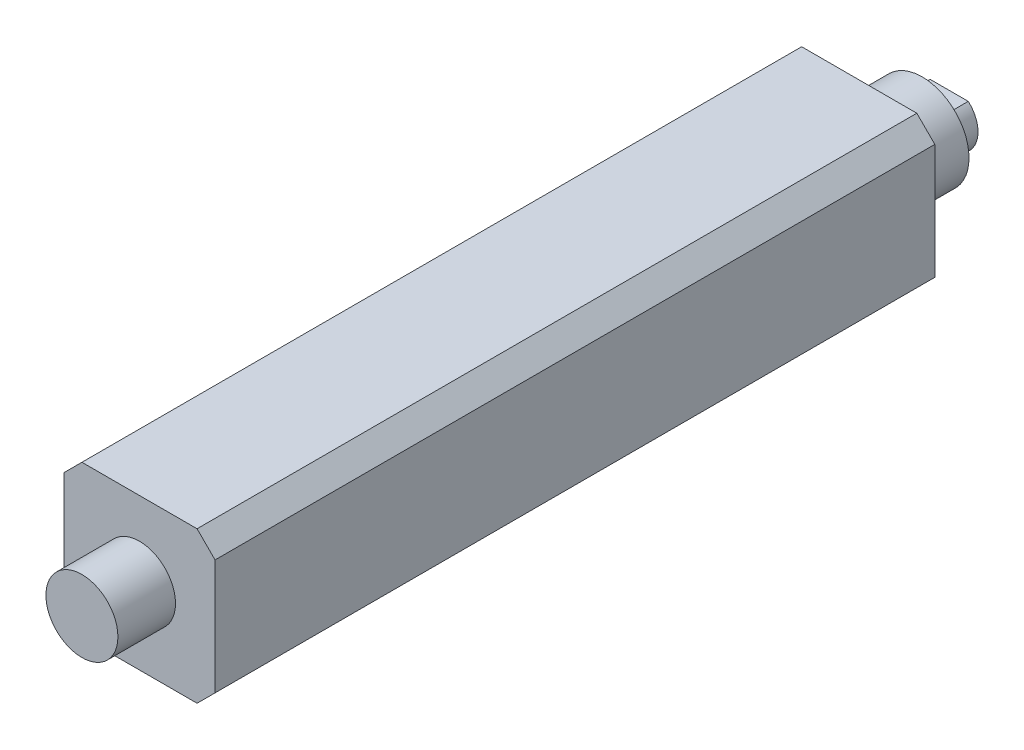
ISO-10303-21;
HEADER;
FILE_DESCRIPTION(('STEP AP214'),'2;1');
FILE_NAME('part.step','',(''),(''),'','','');
FILE_SCHEMA(('AUTOMOTIVE_DESIGN { 1 0 10303 214 1 1 1 1 }'));
ENDSEC;
DATA;
#1=APPLICATION_CONTEXT('core data for automotive mechanical design processes');
#2=APPLICATION_PROTOCOL_DEFINITION('international standard','automotive_design',2000,#1);
#3=PRODUCT_CONTEXT('',#1,'mechanical');
#4=PRODUCT('Part','Part','',(#3));
#5=PRODUCT_RELATED_PRODUCT_CATEGORY('part','',(#4));
#6=PRODUCT_DEFINITION_FORMATION('','',#4);
#7=PRODUCT_DEFINITION_CONTEXT('part definition',#1,'design');
#8=PRODUCT_DEFINITION('design','',#6,#7);
#9=PRODUCT_DEFINITION_SHAPE('','',#8);
#10=(LENGTH_UNIT() NAMED_UNIT(*) SI_UNIT(.MILLI.,.METRE.));
#11=(NAMED_UNIT(*) PLANE_ANGLE_UNIT() SI_UNIT($,.RADIAN.));
#12=(NAMED_UNIT(*) SI_UNIT($,.STERADIAN.) SOLID_ANGLE_UNIT());
#13=UNCERTAINTY_MEASURE_WITH_UNIT(LENGTH_MEASURE(1.E-05),#10,'distance_accuracy_value','');
#14=(GEOMETRIC_REPRESENTATION_CONTEXT(3) GLOBAL_UNCERTAINTY_ASSIGNED_CONTEXT((#13)) GLOBAL_UNIT_ASSIGNED_CONTEXT((#10,
#11,#12)) REPRESENTATION_CONTEXT('',''));
#15=CARTESIAN_POINT('',(0.,0.,0.));
#16=DIRECTION('',(0.,0.,1.));
#17=DIRECTION('',(1.,0.,0.));
#18=AXIS2_PLACEMENT_3D('',#15,#16,#17);
#19=CARTESIAN_POINT('',(-21.,-16.,200.));
#20=DIRECTION('',(1.,0.,0.));
#21=DIRECTION('',(0.,0.,-1.));
#22=AXIS2_PLACEMENT_3D('',#19,#20,#21);
#23=PLANE('',#22);
#24=DIRECTION('',(0.,-1.,0.));
#25=VECTOR('',#24,1.);
#26=CARTESIAN_POINT('',(-21.,-16.,0.));
#27=LINE('',#26,#25);
#28=CARTESIAN_POINT('',(-21.,16.,0.));
#29=VERTEX_POINT('',#28);
#30=CARTESIAN_POINT('',(-21.,-16.,0.));
#31=VERTEX_POINT('',#30);
#32=EDGE_CURVE('E182',#29,#31,#27,.T.);
#33=ORIENTED_EDGE('',*,*,#32,.T.);
#34=DIRECTION('',(0.,0.,-1.));
#35=VECTOR('',#34,1.);
#36=CARTESIAN_POINT('',(-21.,-16.,200.));
#37=LINE('',#36,#35);
#38=CARTESIAN_POINT('',(-21.,-16.,200.));
#39=VERTEX_POINT('',#38);
#40=EDGE_CURVE('E36',#39,#31,#37,.T.);
#41=ORIENTED_EDGE('',*,*,#40,.F.);
#42=DIRECTION('',(0.,-1.,0.));
#43=VECTOR('',#42,1.);
#44=CARTESIAN_POINT('',(-21.,-16.,200.));
#45=LINE('',#44,#43);
#46=CARTESIAN_POINT('',(-21.,16.,200.));
#47=VERTEX_POINT('',#46);
#48=EDGE_CURVE('E185',#47,#39,#45,.T.);
#49=ORIENTED_EDGE('',*,*,#48,.F.);
#50=DIRECTION('',(0.,0.,-1.));
#51=VECTOR('',#50,1.);
#52=CARTESIAN_POINT('',(-21.,16.,200.));
#53=LINE('',#52,#51);
#54=EDGE_CURVE('E203',#47,#29,#53,.T.);
#55=ORIENTED_EDGE('',*,*,#54,.T.);
#56=EDGE_LOOP('',(#33,#41,#49,#55));
#57=FACE_BOUND('',#56,.T.);
#58=ADVANCED_FACE('F33',(#57),#23,.F.);
#59=CARTESIAN_POINT('',(-21.,-16.,200.));
#60=DIRECTION('',(0.707106781186548,0.707106781186547,0.));
#61=DIRECTION('',(-0.707106781186547,0.707106781186548,0.));
#62=AXIS2_PLACEMENT_3D('',#59,#60,#61);
#63=PLANE('',#62);
#64=DIRECTION('',(0.707106781186547,-0.707106781186548,0.));
#65=VECTOR('',#64,1.);
#66=CARTESIAN_POINT('',(-21.,-16.,0.));
#67=LINE('',#66,#65);
#68=CARTESIAN_POINT('',(-16.,-21.,0.));
#69=VERTEX_POINT('',#68);
#70=EDGE_CURVE('E206',#31,#69,#67,.T.);
#71=ORIENTED_EDGE('',*,*,#70,.T.);
#72=DIRECTION('',(0.,0.,-1.));
#73=VECTOR('',#72,1.);
#74=CARTESIAN_POINT('',(-16.,-21.,200.));
#75=LINE('',#74,#73);
#76=CARTESIAN_POINT('',(-16.,-21.,200.));
#77=VERTEX_POINT('',#76);
#78=EDGE_CURVE('E235',#77,#69,#75,.T.);
#79=ORIENTED_EDGE('',*,*,#78,.F.);
#80=DIRECTION('',(0.707106781186547,-0.707106781186548,0.));
#81=VECTOR('',#80,1.);
#82=CARTESIAN_POINT('',(-21.,-16.,200.));
#83=LINE('',#82,#81);
#84=EDGE_CURVE('E188',#39,#77,#83,.T.);
#85=ORIENTED_EDGE('',*,*,#84,.F.);
#86=ORIENTED_EDGE('',*,*,#40,.T.);
#87=EDGE_LOOP('',(#71,#79,#85,#86));
#88=FACE_BOUND('',#87,.T.);
#89=ADVANCED_FACE('F244',(#88),#63,.F.);
#90=CARTESIAN_POINT('',(-16.,-21.,200.));
#91=DIRECTION('',(0.,1.,0.));
#92=DIRECTION('',(0.,0.,1.));
#93=AXIS2_PLACEMENT_3D('',#90,#91,#92);
#94=PLANE('',#93);
#95=DIRECTION('',(1.,0.,0.));
#96=VECTOR('',#95,1.);
#97=CARTESIAN_POINT('',(-16.,-21.,0.));
#98=LINE('',#97,#96);
#99=CARTESIAN_POINT('',(16.,-21.,0.));
#100=VERTEX_POINT('',#99);
#101=EDGE_CURVE('E208',#69,#100,#98,.T.);
#102=ORIENTED_EDGE('',*,*,#101,.T.);
#103=DIRECTION('',(0.,0.,-1.));
#104=VECTOR('',#103,1.);
#105=CARTESIAN_POINT('',(16.,-21.,200.));
#106=LINE('',#105,#104);
#107=CARTESIAN_POINT('',(16.,-21.,200.));
#108=VERTEX_POINT('',#107);
#109=EDGE_CURVE('E233',#108,#100,#106,.T.);
#110=ORIENTED_EDGE('',*,*,#109,.F.);
#111=DIRECTION('',(1.,0.,0.));
#112=VECTOR('',#111,1.);
#113=CARTESIAN_POINT('',(-16.,-21.,200.));
#114=LINE('',#113,#112);
#115=EDGE_CURVE('E191',#77,#108,#114,.T.);
#116=ORIENTED_EDGE('',*,*,#115,.F.);
#117=ORIENTED_EDGE('',*,*,#78,.T.);
#118=EDGE_LOOP('',(#102,#110,#116,#117));
#119=FACE_BOUND('',#118,.T.);
#120=ADVANCED_FACE('F256',(#119),#94,.F.);
#121=CARTESIAN_POINT('',(16.,-21.,200.));
#122=DIRECTION('',(-0.707106781186548,0.707106781186548,0.));
#123=DIRECTION('',(-0.707106781186548,-0.707106781186548,0.));
#124=AXIS2_PLACEMENT_3D('',#121,#122,#123);
#125=PLANE('',#124);
#126=DIRECTION('',(0.707106781186548,0.707106781186548,0.));
#127=VECTOR('',#126,1.);
#128=CARTESIAN_POINT('',(16.,-21.,0.));
#129=LINE('',#128,#127);
#130=CARTESIAN_POINT('',(21.,-16.,0.));
#131=VERTEX_POINT('',#130);
#132=EDGE_CURVE('E210',#100,#131,#129,.T.);
#133=ORIENTED_EDGE('',*,*,#132,.T.);
#134=DIRECTION('',(0.,0.,-1.));
#135=VECTOR('',#134,1.);
#136=CARTESIAN_POINT('',(21.,-16.,200.));
#137=LINE('',#136,#135);
#138=CARTESIAN_POINT('',(21.,-16.,200.));
#139=VERTEX_POINT('',#138);
#140=EDGE_CURVE('E230',#139,#131,#137,.T.);
#141=ORIENTED_EDGE('',*,*,#140,.F.);
#142=DIRECTION('',(0.707106781186548,0.707106781186548,0.));
#143=VECTOR('',#142,1.);
#144=CARTESIAN_POINT('',(16.,-21.,200.));
#145=LINE('',#144,#143);
#146=EDGE_CURVE('E193',#108,#139,#145,.T.);
#147=ORIENTED_EDGE('',*,*,#146,.F.);
#148=ORIENTED_EDGE('',*,*,#109,.T.);
#149=EDGE_LOOP('',(#133,#141,#147,#148));
#150=FACE_BOUND('',#149,.T.);
#151=ADVANCED_FACE('F259',(#150),#125,.F.);
#152=CARTESIAN_POINT('',(21.,-16.,200.));
#153=DIRECTION('',(-1.,0.,0.));
#154=DIRECTION('',(0.,0.,1.));
#155=AXIS2_PLACEMENT_3D('',#152,#153,#154);
#156=PLANE('',#155);
#157=DIRECTION('',(0.,1.,0.));
#158=VECTOR('',#157,1.);
#159=CARTESIAN_POINT('',(21.,-16.,0.));
#160=LINE('',#159,#158);
#161=CARTESIAN_POINT('',(21.,16.,0.));
#162=VERTEX_POINT('',#161);
#163=EDGE_CURVE('E212',#131,#162,#160,.T.);
#164=ORIENTED_EDGE('',*,*,#163,.T.);
#165=DIRECTION('',(0.,0.,-1.));
#166=VECTOR('',#165,1.);
#167=CARTESIAN_POINT('',(21.,16.,200.));
#168=LINE('',#167,#166);
#169=CARTESIAN_POINT('',(21.,16.,200.));
#170=VERTEX_POINT('',#169);
#171=EDGE_CURVE('E227',#170,#162,#168,.T.);
#172=ORIENTED_EDGE('',*,*,#171,.F.);
#173=DIRECTION('',(0.,1.,0.));
#174=VECTOR('',#173,1.);
#175=CARTESIAN_POINT('',(21.,-16.,200.));
#176=LINE('',#175,#174);
#177=EDGE_CURVE('E195',#139,#170,#176,.T.);
#178=ORIENTED_EDGE('',*,*,#177,.F.);
#179=ORIENTED_EDGE('',*,*,#140,.T.);
#180=EDGE_LOOP('',(#164,#172,#178,#179));
#181=FACE_BOUND('',#180,.T.);
#182=ADVANCED_FACE('F278',(#181),#156,.F.);
#183=CARTESIAN_POINT('',(16.,21.,200.));
#184=DIRECTION('',(-0.707106781186547,-0.707106781186548,0.));
#185=DIRECTION('',(0.707106781186548,-0.707106781186547,0.));
#186=AXIS2_PLACEMENT_3D('',#183,#184,#185);
#187=PLANE('',#186);
#188=DIRECTION('',(-0.707106781186548,0.707106781186547,0.));
#189=VECTOR('',#188,1.);
#190=CARTESIAN_POINT('',(16.,21.,0.));
#191=LINE('',#190,#189);
#192=CARTESIAN_POINT('',(16.,21.,0.));
#193=VERTEX_POINT('',#192);
#194=EDGE_CURVE('E214',#162,#193,#191,.T.);
#195=ORIENTED_EDGE('',*,*,#194,.T.);
#196=DIRECTION('',(0.,0.,-1.));
#197=VECTOR('',#196,1.);
#198=CARTESIAN_POINT('',(16.,21.,200.));
#199=LINE('',#198,#197);
#200=CARTESIAN_POINT('',(16.,21.,200.));
#201=VERTEX_POINT('',#200);
#202=EDGE_CURVE('E224',#201,#193,#199,.T.);
#203=ORIENTED_EDGE('',*,*,#202,.F.);
#204=DIRECTION('',(-0.707106781186548,0.707106781186547,0.));
#205=VECTOR('',#204,1.);
#206=CARTESIAN_POINT('',(16.,21.,200.));
#207=LINE('',#206,#205);
#208=EDGE_CURVE('E197',#170,#201,#207,.T.);
#209=ORIENTED_EDGE('',*,*,#208,.F.);
#210=ORIENTED_EDGE('',*,*,#171,.T.);
#211=EDGE_LOOP('',(#195,#203,#209,#210));
#212=FACE_BOUND('',#211,.T.);
#213=ADVANCED_FACE('F275',(#212),#187,.F.);
#214=CARTESIAN_POINT('',(-16.,21.,200.));
#215=DIRECTION('',(0.,-1.,0.));
#216=DIRECTION('',(0.,0.,-1.));
#217=AXIS2_PLACEMENT_3D('',#214,#215,#216);
#218=PLANE('',#217);
#219=DIRECTION('',(-1.,0.,0.));
#220=VECTOR('',#219,1.);
#221=CARTESIAN_POINT('',(-16.,21.,0.));
#222=LINE('',#221,#220);
#223=CARTESIAN_POINT('',(-16.,21.,0.));
#224=VERTEX_POINT('',#223);
#225=EDGE_CURVE('E216',#193,#224,#222,.T.);
#226=ORIENTED_EDGE('',*,*,#225,.T.);
#227=DIRECTION('',(0.,0.,-1.));
#228=VECTOR('',#227,1.);
#229=CARTESIAN_POINT('',(-16.,21.,200.));
#230=LINE('',#229,#228);
#231=CARTESIAN_POINT('',(-16.,21.,200.));
#232=VERTEX_POINT('',#231);
#233=EDGE_CURVE('E221',#232,#224,#230,.T.);
#234=ORIENTED_EDGE('',*,*,#233,.F.);
#235=DIRECTION('',(-1.,0.,0.));
#236=VECTOR('',#235,1.);
#237=CARTESIAN_POINT('',(-16.,21.,200.));
#238=LINE('',#237,#236);
#239=EDGE_CURVE('E199',#201,#232,#238,.T.);
#240=ORIENTED_EDGE('',*,*,#239,.F.);
#241=ORIENTED_EDGE('',*,*,#202,.T.);
#242=EDGE_LOOP('',(#226,#234,#240,#241));
#243=FACE_BOUND('',#242,.T.);
#244=ADVANCED_FACE('F271',(#243),#218,.F.);
#245=CARTESIAN_POINT('',(-21.,16.,200.));
#246=DIRECTION('',(0.707106781186547,-0.707106781186547,0.));
#247=DIRECTION('',(0.707106781186548,0.707106781186548,0.));
#248=AXIS2_PLACEMENT_3D('',#245,#246,#247);
#249=PLANE('',#248);
#250=DIRECTION('',(-0.707106781186547,-0.707106781186547,0.));
#251=VECTOR('',#250,1.);
#252=CARTESIAN_POINT('',(-21.,16.,0.));
#253=LINE('',#252,#251);
#254=EDGE_CURVE('E189',#224,#29,#253,.T.);
#255=ORIENTED_EDGE('',*,*,#254,.T.);
#256=ORIENTED_EDGE('',*,*,#54,.F.);
#257=DIRECTION('',(-0.707106781186547,-0.707106781186547,0.));
#258=VECTOR('',#257,1.);
#259=CARTESIAN_POINT('',(-21.,16.,200.));
#260=LINE('',#259,#258);
#261=EDGE_CURVE('E201',#232,#47,#260,.T.);
#262=ORIENTED_EDGE('',*,*,#261,.F.);
#263=ORIENTED_EDGE('',*,*,#233,.T.);
#264=EDGE_LOOP('',(#255,#256,#262,#263));
#265=FACE_BOUND('',#264,.T.);
#266=ADVANCED_FACE('F269',(#265),#249,.F.);
#267=CARTESIAN_POINT('',(0.,0.,200.));
#268=DIRECTION('',(0.,0.,-1.));
#269=DIRECTION('',(-1.,0.,0.));
#270=AXIS2_PLACEMENT_3D('',#267,#268,#269);
#271=PLANE('',#270);
#272=CARTESIAN_POINT('',(0.,0.,200.));
#273=DIRECTION('',(0.,0.,1.));
#274=DIRECTION('',(1.,0.,0.));
#275=AXIS2_PLACEMENT_3D('',#272,#273,#274);
#276=CIRCLE('',#275,10.);
#277=CARTESIAN_POINT('',(10.,0.,200.));
#278=VERTEX_POINT('',#277);
#279=EDGE_CURVE('E11',#278,#278,#276,.T.);
#280=ORIENTED_EDGE('',*,*,#279,.F.);
#281=EDGE_LOOP('',(#280));
#282=FACE_BOUND('',#281,.T.);
#283=ORIENTED_EDGE('',*,*,#48,.T.);
#284=ORIENTED_EDGE('',*,*,#84,.T.);
#285=ORIENTED_EDGE('',*,*,#115,.T.);
#286=ORIENTED_EDGE('',*,*,#146,.T.);
#287=ORIENTED_EDGE('',*,*,#177,.T.);
#288=ORIENTED_EDGE('',*,*,#208,.T.);
#289=ORIENTED_EDGE('',*,*,#239,.T.);
#290=ORIENTED_EDGE('',*,*,#261,.T.);
#291=EDGE_LOOP('',(#283,#284,#285,#286,#287,#288,#289,#290));
#292=FACE_BOUND('',#291,.T.);
#293=ADVANCED_FACE('F263',(#282,#292),#271,.F.);
#294=CARTESIAN_POINT('',(0.,0.,0.));
#295=DIRECTION('',(0.,0.,-1.));
#296=DIRECTION('',(-1.,0.,0.));
#297=AXIS2_PLACEMENT_3D('',#294,#295,#296);
#298=PLANE('',#297);
#299=CARTESIAN_POINT('',(0.,0.,0.));
#300=DIRECTION('',(0.,0.,1.));
#301=DIRECTION('',(1.,0.,0.));
#302=AXIS2_PLACEMENT_3D('',#299,#300,#301);
#303=CIRCLE('',#302,15.);
#304=CARTESIAN_POINT('',(15.,0.,0.));
#305=VERTEX_POINT('',#304);
#306=EDGE_CURVE('E176',#305,#305,#303,.T.);
#307=ORIENTED_EDGE('',*,*,#306,.T.);
#308=EDGE_LOOP('',(#307));
#309=FACE_BOUND('',#308,.T.);
#310=ORIENTED_EDGE('',*,*,#32,.F.);
#311=ORIENTED_EDGE('',*,*,#254,.F.);
#312=ORIENTED_EDGE('',*,*,#225,.F.);
#313=ORIENTED_EDGE('',*,*,#194,.F.);
#314=ORIENTED_EDGE('',*,*,#163,.F.);
#315=ORIENTED_EDGE('',*,*,#132,.F.);
#316=ORIENTED_EDGE('',*,*,#101,.F.);
#317=ORIENTED_EDGE('',*,*,#70,.F.);
#318=EDGE_LOOP('',(#310,#311,#312,#313,#314,#315,#316,#317));
#319=FACE_BOUND('',#318,.T.);
#320=ADVANCED_FACE('F251',(#309,#319),#298,.T.);
#321=CARTESIAN_POINT('',(0.,0.,-3.));
#322=DIRECTION('',(0.,0.,1.));
#323=DIRECTION('',(1.,0.,0.));
#324=AXIS2_PLACEMENT_3D('',#321,#322,#323);
#325=CYLINDRICAL_SURFACE('',#324,15.);
#326=CARTESIAN_POINT('',(0.,0.,-3.));
#327=DIRECTION('',(0.,0.,1.));
#328=DIRECTION('',(1.,0.,0.));
#329=AXIS2_PLACEMENT_3D('',#326,#327,#328);
#330=CIRCLE('',#329,15.);
#331=CARTESIAN_POINT('',(15.,0.,-3.));
#332=VERTEX_POINT('',#331);
#333=EDGE_CURVE('E179',#332,#332,#330,.T.);
#334=ORIENTED_EDGE('',*,*,#333,.T.);
#335=EDGE_LOOP('',(#334));
#336=FACE_BOUND('',#335,.T.);
#337=ORIENTED_EDGE('',*,*,#306,.F.);
#338=EDGE_LOOP('',(#337));
#339=FACE_BOUND('',#338,.T.);
#340=ADVANCED_FACE('F338',(#336,#339),#325,.T.);
#341=CARTESIAN_POINT('',(0.,0.,-3.));
#342=DIRECTION('',(0.,0.,1.));
#343=DIRECTION('',(1.,0.,0.));
#344=AXIS2_PLACEMENT_3D('',#341,#342,#343);
#345=PLANE('',#344);
#346=CARTESIAN_POINT('',(0.,0.,-3.));
#347=DIRECTION('',(0.,0.,-1.));
#348=DIRECTION('',(-1.,0.,0.));
#349=AXIS2_PLACEMENT_3D('',#346,#347,#348);
#350=CIRCLE('',#349,13.);
#351=CARTESIAN_POINT('',(13.,0.,-3.));
#352=VERTEX_POINT('',#351);
#353=EDGE_CURVE('E172',#352,#352,#350,.T.);
#354=ORIENTED_EDGE('',*,*,#353,.F.);
#355=EDGE_LOOP('',(#354));
#356=FACE_BOUND('',#355,.T.);
#357=ORIENTED_EDGE('',*,*,#333,.F.);
#358=EDGE_LOOP('',(#357));
#359=FACE_BOUND('',#358,.T.);
#360=ADVANCED_FACE('F348',(#356,#359),#345,.F.);
#361=CARTESIAN_POINT('',(0.,0.,-17.5));
#362=DIRECTION('',(0.,0.,1.));
#363=DIRECTION('',(1.,0.,0.));
#364=AXIS2_PLACEMENT_3D('',#361,#362,#363);
#365=CYLINDRICAL_SURFACE('',#364,13.);
#366=CARTESIAN_POINT('',(0.,0.,-17.5));
#367=DIRECTION('',(0.,0.,-1.));
#368=DIRECTION('',(-1.,0.,0.));
#369=AXIS2_PLACEMENT_3D('',#366,#367,#368);
#370=CIRCLE('',#369,13.);
#371=CARTESIAN_POINT('',(13.,0.,-17.5));
#372=VERTEX_POINT('',#371);
#373=EDGE_CURVE('E173',#372,#372,#370,.T.);
#374=CARTESIAN_POINT('',(13.,0.,-17.5));
#375=CARTESIAN_POINT('',(13.,0.,-17.3489583333333));
#376=CARTESIAN_POINT('',(13.,0.,-17.1979166666667));
#377=CARTESIAN_POINT('',(13.,0.,-16.8958333333333));
#378=CARTESIAN_POINT('',(13.,0.,-16.7447916666667));
#379=CARTESIAN_POINT('',(13.,0.,-16.4427083333333));
#380=CARTESIAN_POINT('',(13.,0.,-16.2916666666667));
#381=CARTESIAN_POINT('',(13.,0.,-15.9895833333333));
#382=CARTESIAN_POINT('',(13.,0.,-15.8385416666667));
#383=CARTESIAN_POINT('',(13.,0.,-15.5364583333333));
#384=CARTESIAN_POINT('',(13.,0.,-15.3854166666667));
#385=CARTESIAN_POINT('',(13.,0.,-15.0833333333333));
#386=CARTESIAN_POINT('',(13.,0.,-14.9322916666667));
#387=CARTESIAN_POINT('',(13.,0.,-14.6302083333333));
#388=CARTESIAN_POINT('',(13.,0.,-14.4791666666667));
#389=CARTESIAN_POINT('',(13.,0.,-14.1770833333333));
#390=CARTESIAN_POINT('',(13.,0.,-14.0260416666667));
#391=CARTESIAN_POINT('',(13.,0.,-13.7239583333333));
#392=CARTESIAN_POINT('',(13.,0.,-13.5729166666667));
#393=CARTESIAN_POINT('',(13.,0.,-13.2708333333333));
#394=CARTESIAN_POINT('',(13.,0.,-13.1197916666667));
#395=CARTESIAN_POINT('',(13.,0.,-12.8177083333333));
#396=CARTESIAN_POINT('',(13.,0.,-12.6666666666667));
#397=CARTESIAN_POINT('',(13.,0.,-12.3645833333333));
#398=CARTESIAN_POINT('',(13.,0.,-12.2135416666667));
#399=CARTESIAN_POINT('',(13.,0.,-11.9114583333333));
#400=CARTESIAN_POINT('',(13.,0.,-11.7604166666667));
#401=CARTESIAN_POINT('',(13.,0.,-11.4583333333333));
#402=CARTESIAN_POINT('',(13.,0.,-11.3072916666667));
#403=CARTESIAN_POINT('',(13.,0.,-11.0052083333333));
#404=CARTESIAN_POINT('',(13.,0.,-10.8541666666667));
#405=CARTESIAN_POINT('',(13.,0.,-10.5520833333333));
#406=CARTESIAN_POINT('',(13.,0.,-10.4010416666667));
#407=CARTESIAN_POINT('',(13.,0.,-10.0989583333333));
#408=CARTESIAN_POINT('',(13.,0.,-9.94791666666667));
#409=CARTESIAN_POINT('',(13.,0.,-9.64583333333333));
#410=CARTESIAN_POINT('',(13.,0.,-9.49479166666667));
#411=CARTESIAN_POINT('',(13.,0.,-9.19270833333333));
#412=CARTESIAN_POINT('',(13.,0.,-9.04166666666667));
#413=CARTESIAN_POINT('',(13.,0.,-8.73958333333333));
#414=CARTESIAN_POINT('',(13.,0.,-8.58854166666667));
#415=CARTESIAN_POINT('',(13.,0.,-8.28645833333334));
#416=CARTESIAN_POINT('',(13.,0.,-8.13541666666667));
#417=CARTESIAN_POINT('',(13.,0.,-7.83333333333333));
#418=CARTESIAN_POINT('',(13.,0.,-7.68229166666667));
#419=CARTESIAN_POINT('',(13.,0.,-7.38020833333333));
#420=CARTESIAN_POINT('',(13.,0.,-7.22916666666667));
#421=CARTESIAN_POINT('',(13.,0.,-6.92708333333333));
#422=CARTESIAN_POINT('',(13.,0.,-6.77604166666667));
#423=CARTESIAN_POINT('',(13.,0.,-6.47395833333333));
#424=CARTESIAN_POINT('',(13.,0.,-6.32291666666667));
#425=CARTESIAN_POINT('',(13.,0.,-6.02083333333333));
#426=CARTESIAN_POINT('',(13.,0.,-5.86979166666667));
#427=CARTESIAN_POINT('',(13.,0.,-5.56770833333333));
#428=CARTESIAN_POINT('',(13.,0.,-5.41666666666667));
#429=CARTESIAN_POINT('',(13.,0.,-5.11458333333333));
#430=CARTESIAN_POINT('',(13.,0.,-4.96354166666667));
#431=CARTESIAN_POINT('',(13.,0.,-4.66145833333333));
#432=CARTESIAN_POINT('',(13.,0.,-4.51041666666667));
#433=CARTESIAN_POINT('',(13.,0.,-4.20833333333333));
#434=CARTESIAN_POINT('',(13.,0.,-4.05729166666667));
#435=CARTESIAN_POINT('',(13.,0.,-3.75520833333333));
#436=CARTESIAN_POINT('',(13.,0.,-3.60416666666667));
#437=CARTESIAN_POINT('',(13.,0.,-3.30208333333333));
#438=CARTESIAN_POINT('',(13.,0.,-3.15104166666667));
#439=CARTESIAN_POINT('',(13.,0.,-3.));
#440=B_SPLINE_CURVE_WITH_KNOTS('',3,(#374,#375,#376,#377,#378,#379,#380,#381,#382,#383,#384,
#385,#386,#387,#388,#389,#390,#391,#392,#393,#394,#395,#396,#397,#398,#399,#400,#401,#402,#403,
#404,#405,#406,#407,#408,#409,#410,#411,#412,#413,#414,#415,#416,#417,#418,#419,#420,#421,#422,
#423,#424,#425,#426,#427,#428,#429,#430,#431,#432,#433,#434,#435,#436,#437,#438,#439),
.UNSPECIFIED.,.F.,.F.,(4,2,2,2,2,2,2,2,2,2,2,2,2,2,2,2,2,2,2,2,2,2,2,2,2,2,2,2,2,2,2,2,4),(0.,
0.453125000000002,0.906250000000001,1.359375,1.8125,2.265625,2.71875,3.171875,3.625,4.078125,
4.53125,4.984375,5.4375,5.890625,6.34375,6.796875,7.25,7.703125,8.15625,8.609375,9.0625,
9.515625,9.96875,10.421875,10.875,11.328125,11.78125,12.234375,12.6875,13.140625,13.59375,
14.046875,14.5),.UNSPECIFIED.);
#441=EDGE_CURVE('BSEAM358',#372,#352,#440,.T.);
#442=ORIENTED_EDGE('',*,*,#373,.F.);
#443=ORIENTED_EDGE('',*,*,#353,.T.);
#444=ORIENTED_EDGE('',*,*,#441,.T.);
#445=ORIENTED_EDGE('',*,*,#441,.F.);
#446=EDGE_LOOP('',(#442,#444,#443,#445));
#447=FACE_BOUND('',#446,.T.);
#448=ADVANCED_FACE('F358',(#447),#365,.T.);
#449=CARTESIAN_POINT('',(0.,0.,-17.5));
#450=DIRECTION('',(0.,0.,-1.));
#451=DIRECTION('',(-1.,0.,0.));
#452=AXIS2_PLACEMENT_3D('',#449,#450,#451);
#453=PLANE('',#452);
#454=CARTESIAN_POINT('',(0.,0.,-17.5));
#455=DIRECTION('',(0.,0.,-1.));
#456=DIRECTION('',(-1.,0.,0.));
#457=AXIS2_PLACEMENT_3D('',#454,#455,#456);
#458=CIRCLE('',#457,8.);
#459=CARTESIAN_POINT('',(-8.,0.,-17.5));
#460=VERTEX_POINT('',#459);
#461=EDGE_CURVE('E41',#460,#460,#458,.T.);
#462=ORIENTED_EDGE('',*,*,#461,.F.);
#463=EDGE_LOOP('',(#462));
#464=FACE_BOUND('',#463,.T.);
#465=ORIENTED_EDGE('',*,*,#373,.T.);
#466=EDGE_LOOP('',(#465));
#467=FACE_BOUND('',#466,.T.);
#468=ADVANCED_FACE('F368',(#464,#467),#453,.T.);
#469=CARTESIAN_POINT('',(0.,0.,-25.));
#470=DIRECTION('',(0.,0.,1.));
#471=DIRECTION('',(1.,0.,0.));
#472=AXIS2_PLACEMENT_3D('',#469,#470,#471);
#473=CYLINDRICAL_SURFACE('',#472,8.);
#474=CARTESIAN_POINT('',(0.,0.,-25.));
#475=DIRECTION('',(0.,0.,-1.));
#476=DIRECTION('',(-1.,0.,0.));
#477=AXIS2_PLACEMENT_3D('',#474,#475,#476);
#478=CIRCLE('',#477,8.);
#479=CARTESIAN_POINT('',(5.29150262212918,6.,-25.));
#480=VERTEX_POINT('',#479);
#481=CARTESIAN_POINT('',(5.29150262212918,-6.,-25.));
#482=VERTEX_POINT('',#481);
#483=EDGE_CURVE('E169',#480,#482,#478,.T.);
#484=ORIENTED_EDGE('',*,*,#483,.F.);
#485=DIRECTION('',(0.,0.,-1.));
#486=VECTOR('',#485,1.);
#487=CARTESIAN_POINT('',(5.29150262212918,6.,-20.));
#488=LINE('',#487,#486);
#489=CARTESIAN_POINT('',(5.29150262212918,6.,-20.));
#490=VERTEX_POINT('',#489);
#491=EDGE_CURVE('E57',#490,#480,#488,.T.);
#492=ORIENTED_EDGE('',*,*,#491,.F.);
#493=CARTESIAN_POINT('',(0.,0.,-20.));
#494=DIRECTION('',(0.,0.,-1.));
#495=DIRECTION('',(-1.,0.,0.));
#496=AXIS2_PLACEMENT_3D('',#493,#494,#495);
#497=CIRCLE('',#496,8.);
#498=CARTESIAN_POINT('',(-5.29150262212918,6.,-20.));
#499=VERTEX_POINT('',#498);
#500=EDGE_CURVE('E144',#499,#490,#497,.T.);
#501=ORIENTED_EDGE('',*,*,#500,.F.);
#502=DIRECTION('',(0.,0.,-1.));
#503=VECTOR('',#502,1.);
#504=CARTESIAN_POINT('',(-5.29150262212918,6.,-20.));
#505=LINE('',#504,#503);
#506=CARTESIAN_POINT('',(-5.29150262212918,6.,-25.));
#507=VERTEX_POINT('',#506);
#508=EDGE_CURVE('E152',#499,#507,#505,.T.);
#509=ORIENTED_EDGE('',*,*,#508,.T.);
#510=CARTESIAN_POINT('',(-5.29150262212918,-6.,-25.));
#511=VERTEX_POINT('',#510);
#512=EDGE_CURVE('E165',#511,#507,#478,.T.);
#513=ORIENTED_EDGE('',*,*,#512,.F.);
#514=DIRECTION('',(0.,0.,-1.));
#515=VECTOR('',#514,1.);
#516=CARTESIAN_POINT('',(-5.29150262212918,-6.,-20.));
#517=LINE('',#516,#515);
#518=CARTESIAN_POINT('',(-5.29150262212918,-6.,-20.));
#519=VERTEX_POINT('',#518);
#520=EDGE_CURVE('E49',#519,#511,#517,.T.);
#521=ORIENTED_EDGE('',*,*,#520,.F.);
#522=CARTESIAN_POINT('',(0.,0.,-20.));
#523=DIRECTION('',(0.,0.,-1.));
#524=DIRECTION('',(-1.,0.,0.));
#525=AXIS2_PLACEMENT_3D('',#522,#523,#524);
#526=CIRCLE('',#525,8.);
#527=CARTESIAN_POINT('',(5.29150262212918,-6.,-20.));
#528=VERTEX_POINT('',#527);
#529=EDGE_CURVE('E139',#528,#519,#526,.T.);
#530=ORIENTED_EDGE('',*,*,#529,.F.);
#531=DIRECTION('',(0.,0.,-1.));
#532=VECTOR('',#531,1.);
#533=CARTESIAN_POINT('',(5.29150262212918,-6.,-20.));
#534=LINE('',#533,#532);
#535=EDGE_CURVE('E151',#528,#482,#534,.T.);
#536=ORIENTED_EDGE('',*,*,#535,.T.);
#537=EDGE_LOOP('',(#484,#492,#501,#509,#513,#521,#530,#536));
#538=FACE_BOUND('',#537,.T.);
#539=ORIENTED_EDGE('',*,*,#461,.T.);
#540=EDGE_LOOP('',(#539));
#541=FACE_BOUND('',#540,.T.);
#542=ADVANCED_FACE('F378',(#538,#541),#473,.T.);
#543=CARTESIAN_POINT('',(0.,0.,-25.));
#544=DIRECTION('',(0.,0.,-1.));
#545=DIRECTION('',(-1.,0.,0.));
#546=AXIS2_PLACEMENT_3D('',#543,#544,#545);
#547=PLANE('',#546);
#548=CARTESIAN_POINT('',(0.,0.,-25.));
#549=DIRECTION('',(0.,0.,-1.));
#550=DIRECTION('',(-1.,0.,0.));
#551=AXIS2_PLACEMENT_3D('',#548,#549,#550);
#552=CIRCLE('',#551,4.4);
#553=CARTESIAN_POINT('',(-4.4,0.,-25.));
#554=VERTEX_POINT('',#553);
#555=EDGE_CURVE('E137',#554,#554,#552,.T.);
#556=ORIENTED_EDGE('',*,*,#555,.F.);
#557=EDGE_LOOP('',(#556));
#558=FACE_BOUND('',#557,.T.);
#559=DIRECTION('',(-1.,0.,0.));
#560=VECTOR('',#559,1.);
#561=CARTESIAN_POINT('',(5.29150262212918,6.,-25.));
#562=LINE('',#561,#560);
#563=EDGE_CURVE('E147',#480,#507,#562,.T.);
#564=ORIENTED_EDGE('',*,*,#563,.F.);
#565=ORIENTED_EDGE('',*,*,#483,.T.);
#566=DIRECTION('',(1.,0.,0.));
#567=VECTOR('',#566,1.);
#568=CARTESIAN_POINT('',(5.29150262212918,-6.,-25.));
#569=LINE('',#568,#567);
#570=EDGE_CURVE('E136',#511,#482,#569,.T.);
#571=ORIENTED_EDGE('',*,*,#570,.F.);
#572=ORIENTED_EDGE('',*,*,#512,.T.);
#573=EDGE_LOOP('',(#564,#565,#571,#572));
#574=FACE_BOUND('',#573,.T.);
#575=ADVANCED_FACE('F399',(#558,#574),#547,.T.);
#576=CARTESIAN_POINT('',(0.,0.,216.));
#577=DIRECTION('',(0.,0.,-1.));
#578=DIRECTION('',(-1.,0.,0.));
#579=AXIS2_PLACEMENT_3D('',#576,#577,#578);
#580=CYLINDRICAL_SURFACE('',#579,10.);
#581=CARTESIAN_POINT('',(0.,0.,216.));
#582=DIRECTION('',(0.,0.,1.));
#583=DIRECTION('',(1.,0.,0.));
#584=AXIS2_PLACEMENT_3D('',#581,#582,#583);
#585=CIRCLE('',#584,10.);
#586=CARTESIAN_POINT('',(10.,0.,216.));
#587=VERTEX_POINT('',#586);
#588=EDGE_CURVE('E155',#587,#587,#585,.T.);
#589=ORIENTED_EDGE('',*,*,#588,.F.);
#590=EDGE_LOOP('',(#589));
#591=FACE_BOUND('',#590,.T.);
#592=ORIENTED_EDGE('',*,*,#279,.T.);
#593=EDGE_LOOP('',(#592));
#594=FACE_BOUND('',#593,.T.);
#595=ADVANCED_FACE('F393',(#591,#594),#580,.T.);
#596=CARTESIAN_POINT('',(0.,0.,216.));
#597=DIRECTION('',(0.,0.,1.));
#598=DIRECTION('',(1.,0.,0.));
#599=AXIS2_PLACEMENT_3D('',#596,#597,#598);
#600=PLANE('',#599);
#601=ORIENTED_EDGE('',*,*,#588,.T.);
#602=EDGE_LOOP('',(#601));
#603=FACE_BOUND('',#602,.T.);
#604=ADVANCED_FACE('F398',(#603),#600,.T.);
#605=CARTESIAN_POINT('',(5.29150262212918,-6.,-20.));
#606=DIRECTION('',(0.,1.,0.));
#607=DIRECTION('',(0.,0.,1.));
#608=AXIS2_PLACEMENT_3D('',#605,#606,#607);
#609=PLANE('',#608);
#610=ORIENTED_EDGE('',*,*,#570,.T.);
#611=ORIENTED_EDGE('',*,*,#535,.F.);
#612=DIRECTION('',(1.,0.,0.));
#613=VECTOR('',#612,1.);
#614=CARTESIAN_POINT('',(5.29150262212918,-6.,-20.));
#615=LINE('',#614,#613);
#616=EDGE_CURVE('E158',#519,#528,#615,.T.);
#617=ORIENTED_EDGE('',*,*,#616,.F.);
#618=ORIENTED_EDGE('',*,*,#520,.T.);
#619=EDGE_LOOP('',(#610,#611,#617,#618));
#620=FACE_BOUND('',#619,.T.);
#621=ADVANCED_FACE('F411',(#620),#609,.F.);
#622=CARTESIAN_POINT('',(0.,0.,-20.));
#623=DIRECTION('',(0.,0.,-1.));
#624=DIRECTION('',(-1.,0.,0.));
#625=AXIS2_PLACEMENT_3D('',#622,#623,#624);
#626=PLANE('',#625);
#627=ORIENTED_EDGE('',*,*,#529,.T.);
#628=ORIENTED_EDGE('',*,*,#616,.T.);
#629=EDGE_LOOP('',(#627,#628));
#630=FACE_BOUND('',#629,.T.);
#631=ADVANCED_FACE('F428',(#630),#626,.T.);
#632=CARTESIAN_POINT('',(5.29150262212918,6.,-20.));
#633=DIRECTION('',(0.,-1.,0.));
#634=DIRECTION('',(0.,0.,-1.));
#635=AXIS2_PLACEMENT_3D('',#632,#633,#634);
#636=PLANE('',#635);
#637=ORIENTED_EDGE('',*,*,#563,.T.);
#638=ORIENTED_EDGE('',*,*,#508,.F.);
#639=DIRECTION('',(-1.,0.,0.));
#640=VECTOR('',#639,1.);
#641=CARTESIAN_POINT('',(5.29150262212918,6.,-20.));
#642=LINE('',#641,#640);
#643=EDGE_CURVE('E146',#490,#499,#642,.T.);
#644=ORIENTED_EDGE('',*,*,#643,.F.);
#645=ORIENTED_EDGE('',*,*,#491,.T.);
#646=EDGE_LOOP('',(#637,#638,#644,#645));
#647=FACE_BOUND('',#646,.T.);
#648=ADVANCED_FACE('F437',(#647),#636,.F.);
#649=CARTESIAN_POINT('',(0.,0.,-20.));
#650=DIRECTION('',(0.,0.,-1.));
#651=DIRECTION('',(-1.,0.,0.));
#652=AXIS2_PLACEMENT_3D('',#649,#650,#651);
#653=PLANE('',#652);
#654=ORIENTED_EDGE('',*,*,#500,.T.);
#655=ORIENTED_EDGE('',*,*,#643,.T.);
#656=EDGE_LOOP('',(#654,#655));
#657=FACE_BOUND('',#656,.T.);
#658=ADVANCED_FACE('F130',(#657),#653,.T.);
#659=CARTESIAN_POINT('',(0.,0.,-10.));
#660=DIRECTION('',(0.,0.,-1.));
#661=DIRECTION('',(-1.,0.,0.));
#662=AXIS2_PLACEMENT_3D('',#659,#660,#661);
#663=CONICAL_SURFACE('',#662,4.4,1.02974425867665);
#664=CARTESIAN_POINT('',(0.,0.,-7.35621327627873));
#665=VERTEX_POINT('',#664);
#666=VERTEX_LOOP('',#665);
#667=FACE_BOUND('',#666,.T.);
#668=CARTESIAN_POINT('',(0.,0.,-10.));
#669=DIRECTION('',(0.,0.,-1.));
#670=DIRECTION('',(-1.,0.,0.));
#671=AXIS2_PLACEMENT_3D('',#668,#669,#670);
#672=CIRCLE('',#671,4.4);
#673=CARTESIAN_POINT('',(-4.4,0.,-10.));
#674=VERTEX_POINT('',#673);
#675=EDGE_CURVE('E134',#674,#674,#672,.T.);
#676=ORIENTED_EDGE('',*,*,#675,.T.);
#677=EDGE_LOOP('',(#676));
#678=FACE_BOUND('',#677,.T.);
#679=ADVANCED_FACE('F126',(#667,#678),#663,.F.);
#680=CARTESIAN_POINT('',(0.,0.,-25.));
#681=DIRECTION('',(0.,0.,-1.));
#682=DIRECTION('',(-1.,0.,0.));
#683=AXIS2_PLACEMENT_3D('',#680,#681,#682);
#684=CYLINDRICAL_SURFACE('',#683,4.4);
#685=ORIENTED_EDGE('',*,*,#675,.F.);
#686=EDGE_LOOP('',(#685));
#687=FACE_BOUND('',#686,.T.);
#688=ORIENTED_EDGE('',*,*,#555,.T.);
#689=EDGE_LOOP('',(#688));
#690=FACE_BOUND('',#689,.T.);
#691=ADVANCED_FACE('F129',(#687,#690),#684,.F.);
#692=CLOSED_SHELL('',(#58,#89,#120,#151,#182,#213,#244,#266,#293,#320,#340,#360,#448,#468,#542,
#575,#595,#604,#621,#631,#648,#658,#679,#691));
#693=MANIFOLD_SOLID_BREP('B2',#692);
#694=ADVANCED_BREP_SHAPE_REPRESENTATION('',(#18,#693),#14);
#695=SHAPE_DEFINITION_REPRESENTATION(#9,#694);
ENDSEC;
END-ISO-10303-21;
